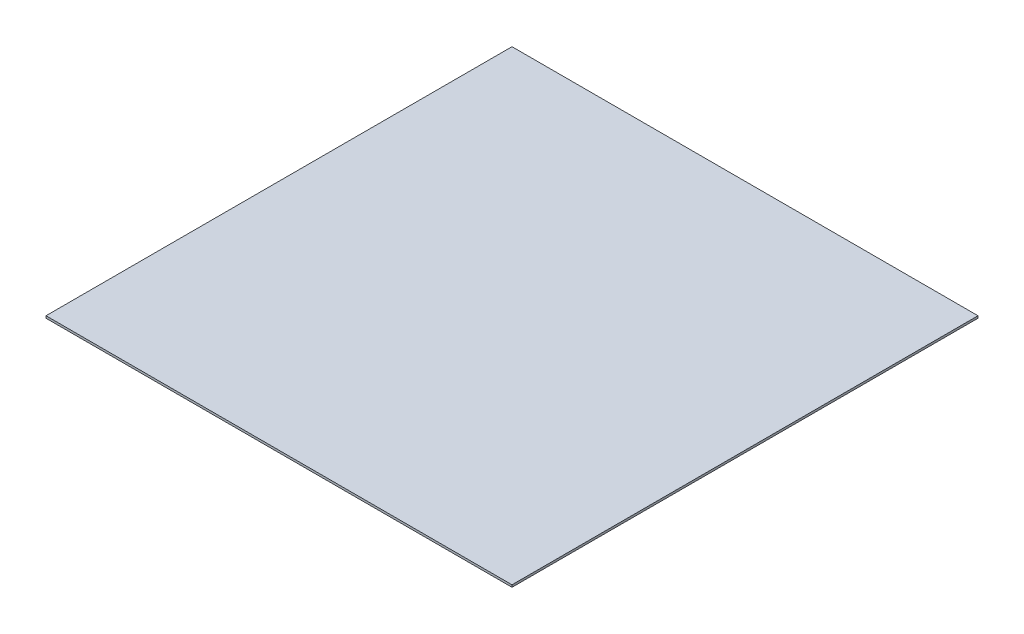
ISO-10303-21;
HEADER;
FILE_DESCRIPTION(('STEP AP214'),'2;1');
FILE_NAME('part.step','',(''),(''),'','','');
FILE_SCHEMA(('AUTOMOTIVE_DESIGN { 1 0 10303 214 1 1 1 1 }'));
ENDSEC;
DATA;
#1=APPLICATION_CONTEXT('core data for automotive mechanical design processes');
#2=APPLICATION_PROTOCOL_DEFINITION('international standard','automotive_design',2000,#1);
#3=PRODUCT_CONTEXT('',#1,'mechanical');
#4=PRODUCT('Part','Part','',(#3));
#5=PRODUCT_RELATED_PRODUCT_CATEGORY('part','',(#4));
#6=PRODUCT_DEFINITION_FORMATION('','',#4);
#7=PRODUCT_DEFINITION_CONTEXT('part definition',#1,'design');
#8=PRODUCT_DEFINITION('design','',#6,#7);
#9=PRODUCT_DEFINITION_SHAPE('','',#8);
#10=(LENGTH_UNIT() NAMED_UNIT(*) SI_UNIT(.MILLI.,.METRE.));
#11=(NAMED_UNIT(*) PLANE_ANGLE_UNIT() SI_UNIT($,.RADIAN.));
#12=(NAMED_UNIT(*) SI_UNIT($,.STERADIAN.) SOLID_ANGLE_UNIT());
#13=UNCERTAINTY_MEASURE_WITH_UNIT(LENGTH_MEASURE(1.E-05),#10,'distance_accuracy_value','');
#14=(GEOMETRIC_REPRESENTATION_CONTEXT(3) GLOBAL_UNCERTAINTY_ASSIGNED_CONTEXT((#13)) GLOBAL_UNIT_ASSIGNED_CONTEXT((#10,
#11,#12)) REPRESENTATION_CONTEXT('',''));
#15=CARTESIAN_POINT('',(0.,0.,0.));
#16=DIRECTION('',(0.,0.,1.));
#17=DIRECTION('',(1.,0.,0.));
#18=AXIS2_PLACEMENT_3D('',#15,#16,#17);
#19=CARTESIAN_POINT('',(-743.,7.,743.));
#20=DIRECTION('',(-1.,0.,0.));
#21=DIRECTION('',(0.,0.,1.));
#22=AXIS2_PLACEMENT_3D('',#19,#20,#21);
#23=PLANE('',#22);
#24=DIRECTION('',(0.,0.,-1.));
#25=VECTOR('',#24,1.);
#26=CARTESIAN_POINT('',(-743.,0.,743.));
#27=LINE('',#26,#25);
#28=CARTESIAN_POINT('',(-743.,0.,743.));
#29=VERTEX_POINT('',#28);
#30=CARTESIAN_POINT('',(-743.,0.,-743.));
#31=VERTEX_POINT('',#30);
#32=EDGE_CURVE('E110',#29,#31,#27,.T.);
#33=ORIENTED_EDGE('',*,*,#32,.F.);
#34=DIRECTION('',(0.,-1.,0.));
#35=VECTOR('',#34,1.);
#36=CARTESIAN_POINT('',(-743.,7.,743.));
#37=LINE('',#36,#35);
#38=CARTESIAN_POINT('',(-743.,7.,743.));
#39=VERTEX_POINT('',#38);
#40=EDGE_CURVE('E11',#39,#29,#37,.T.);
#41=ORIENTED_EDGE('',*,*,#40,.F.);
#42=DIRECTION('',(0.,0.,-1.));
#43=VECTOR('',#42,1.);
#44=CARTESIAN_POINT('',(-743.,7.,743.));
#45=LINE('',#44,#43);
#46=CARTESIAN_POINT('',(-743.,7.,-743.));
#47=VERTEX_POINT('',#46);
#48=EDGE_CURVE('E103',#39,#47,#45,.T.);
#49=ORIENTED_EDGE('',*,*,#48,.T.);
#50=DIRECTION('',(0.,-1.,0.));
#51=VECTOR('',#50,1.);
#52=CARTESIAN_POINT('',(-743.,7.,-743.));
#53=LINE('',#52,#51);
#54=EDGE_CURVE('E42',#47,#31,#53,.T.);
#55=ORIENTED_EDGE('',*,*,#54,.T.);
#56=EDGE_LOOP('',(#33,#41,#49,#55));
#57=FACE_BOUND('',#56,.T.);
#58=ADVANCED_FACE('F39',(#57),#23,.T.);
#59=CARTESIAN_POINT('',(-743.,7.,743.));
#60=DIRECTION('',(0.,0.,-1.));
#61=DIRECTION('',(-1.,0.,0.));
#62=AXIS2_PLACEMENT_3D('',#59,#60,#61);
#63=PLANE('',#62);
#64=DIRECTION('',(1.,0.,0.));
#65=VECTOR('',#64,1.);
#66=CARTESIAN_POINT('',(-743.,0.,743.));
#67=LINE('',#66,#65);
#68=CARTESIAN_POINT('',(743.,0.,743.));
#69=VERTEX_POINT('',#68);
#70=EDGE_CURVE('E73',#29,#69,#67,.T.);
#71=ORIENTED_EDGE('',*,*,#70,.T.);
#72=DIRECTION('',(0.,-1.,0.));
#73=VECTOR('',#72,1.);
#74=CARTESIAN_POINT('',(743.,7.,743.));
#75=LINE('',#74,#73);
#76=CARTESIAN_POINT('',(743.,7.,743.));
#77=VERTEX_POINT('',#76);
#78=EDGE_CURVE('E49',#77,#69,#75,.T.);
#79=ORIENTED_EDGE('',*,*,#78,.F.);
#80=DIRECTION('',(1.,0.,0.));
#81=VECTOR('',#80,1.);
#82=CARTESIAN_POINT('',(-743.,7.,743.));
#83=LINE('',#82,#81);
#84=EDGE_CURVE('E90',#39,#77,#83,.T.);
#85=ORIENTED_EDGE('',*,*,#84,.F.);
#86=ORIENTED_EDGE('',*,*,#40,.T.);
#87=EDGE_LOOP('',(#71,#79,#85,#86));
#88=FACE_BOUND('',#87,.T.);
#89=ADVANCED_FACE('F126',(#88),#63,.F.);
#90=CARTESIAN_POINT('',(743.,7.,743.));
#91=DIRECTION('',(-1.,0.,0.));
#92=DIRECTION('',(0.,0.,1.));
#93=AXIS2_PLACEMENT_3D('',#90,#91,#92);
#94=PLANE('',#93);
#95=DIRECTION('',(0.,0.,-1.));
#96=VECTOR('',#95,1.);
#97=CARTESIAN_POINT('',(743.,0.,743.));
#98=LINE('',#97,#96);
#99=CARTESIAN_POINT('',(743.,0.,-743.));
#100=VERTEX_POINT('',#99);
#101=EDGE_CURVE('E98',#69,#100,#98,.T.);
#102=ORIENTED_EDGE('',*,*,#101,.T.);
#103=DIRECTION('',(0.,-1.,0.));
#104=VECTOR('',#103,1.);
#105=CARTESIAN_POINT('',(743.,7.,-743.));
#106=LINE('',#105,#104);
#107=CARTESIAN_POINT('',(743.,7.,-743.));
#108=VERTEX_POINT('',#107);
#109=EDGE_CURVE('E95',#108,#100,#106,.T.);
#110=ORIENTED_EDGE('',*,*,#109,.F.);
#111=DIRECTION('',(0.,0.,-1.));
#112=VECTOR('',#111,1.);
#113=CARTESIAN_POINT('',(743.,7.,743.));
#114=LINE('',#113,#112);
#115=EDGE_CURVE('E85',#77,#108,#114,.T.);
#116=ORIENTED_EDGE('',*,*,#115,.F.);
#117=ORIENTED_EDGE('',*,*,#78,.T.);
#118=EDGE_LOOP('',(#102,#110,#116,#117));
#119=FACE_BOUND('',#118,.T.);
#120=ADVANCED_FACE('F96',(#119),#94,.F.);
#121=CARTESIAN_POINT('',(-743.,7.,-743.));
#122=DIRECTION('',(0.,0.,-1.));
#123=DIRECTION('',(-1.,0.,0.));
#124=AXIS2_PLACEMENT_3D('',#121,#122,#123);
#125=PLANE('',#124);
#126=DIRECTION('',(1.,0.,0.));
#127=VECTOR('',#126,1.);
#128=CARTESIAN_POINT('',(-743.,0.,-743.));
#129=LINE('',#128,#127);
#130=EDGE_CURVE('E114',#31,#100,#129,.T.);
#131=ORIENTED_EDGE('',*,*,#130,.F.);
#132=ORIENTED_EDGE('',*,*,#54,.F.);
#133=DIRECTION('',(1.,0.,0.));
#134=VECTOR('',#133,1.);
#135=CARTESIAN_POINT('',(-743.,7.,-743.));
#136=LINE('',#135,#134);
#137=EDGE_CURVE('E89',#47,#108,#136,.T.);
#138=ORIENTED_EDGE('',*,*,#137,.T.);
#139=ORIENTED_EDGE('',*,*,#109,.T.);
#140=EDGE_LOOP('',(#131,#132,#138,#139));
#141=FACE_BOUND('',#140,.T.);
#142=ADVANCED_FACE('F101',(#141),#125,.T.);
#143=CARTESIAN_POINT('',(0.,7.,0.));
#144=DIRECTION('',(0.,-1.,0.));
#145=DIRECTION('',(0.,0.,-1.));
#146=AXIS2_PLACEMENT_3D('',#143,#144,#145);
#147=PLANE('',#146);
#148=ORIENTED_EDGE('',*,*,#48,.F.);
#149=ORIENTED_EDGE('',*,*,#84,.T.);
#150=ORIENTED_EDGE('',*,*,#115,.T.);
#151=ORIENTED_EDGE('',*,*,#137,.F.);
#152=EDGE_LOOP('',(#148,#149,#150,#151));
#153=FACE_BOUND('',#152,.T.);
#154=ADVANCED_FACE('F88',(#153),#147,.F.);
#155=CARTESIAN_POINT('',(0.,0.,0.));
#156=DIRECTION('',(0.,-1.,0.));
#157=DIRECTION('',(0.,0.,-1.));
#158=AXIS2_PLACEMENT_3D('',#155,#156,#157);
#159=PLANE('',#158);
#160=ORIENTED_EDGE('',*,*,#32,.T.);
#161=ORIENTED_EDGE('',*,*,#130,.T.);
#162=ORIENTED_EDGE('',*,*,#101,.F.);
#163=ORIENTED_EDGE('',*,*,#70,.F.);
#164=EDGE_LOOP('',(#160,#161,#162,#163));
#165=FACE_BOUND('',#164,.T.);
#166=ADVANCED_FACE('F123',(#165),#159,.T.);
#167=CLOSED_SHELL('',(#58,#89,#120,#142,#154,#166));
#168=MANIFOLD_SOLID_BREP('B2',#167);
#169=ADVANCED_BREP_SHAPE_REPRESENTATION('',(#18,#168),#14);
#170=SHAPE_DEFINITION_REPRESENTATION(#9,#169);
ENDSEC;
END-ISO-10303-21;
